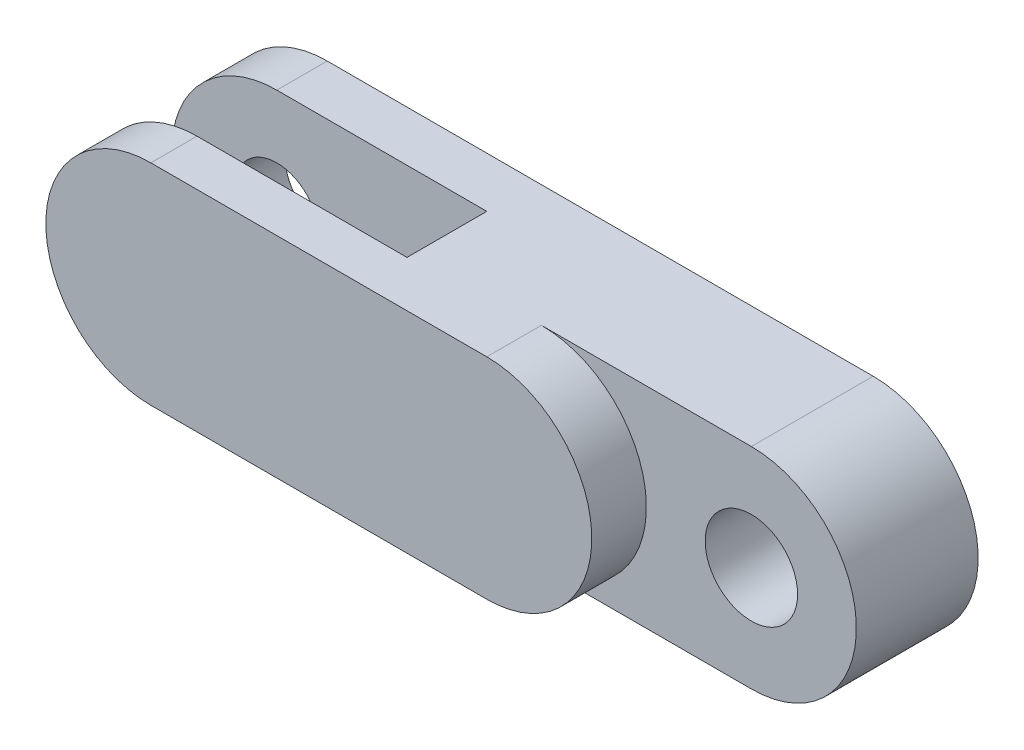
ISO-10303-21;
HEADER;
FILE_DESCRIPTION(('STEP AP214'),'2;1');
FILE_NAME('part.step','',(''),(''),'','','');
FILE_SCHEMA(('AUTOMOTIVE_DESIGN { 1 0 10303 214 1 1 1 1 }'));
ENDSEC;
DATA;
#1=APPLICATION_CONTEXT('core data for automotive mechanical design processes');
#2=APPLICATION_PROTOCOL_DEFINITION('international standard','automotive_design',2000,#1);
#3=PRODUCT_CONTEXT('',#1,'mechanical');
#4=PRODUCT('Part','Part','',(#3));
#5=PRODUCT_RELATED_PRODUCT_CATEGORY('part','',(#4));
#6=PRODUCT_DEFINITION_FORMATION('','',#4);
#7=PRODUCT_DEFINITION_CONTEXT('part definition',#1,'design');
#8=PRODUCT_DEFINITION('design','',#6,#7);
#9=PRODUCT_DEFINITION_SHAPE('','',#8);
#10=(LENGTH_UNIT() NAMED_UNIT(*) SI_UNIT(.MILLI.,.METRE.));
#11=(NAMED_UNIT(*) PLANE_ANGLE_UNIT() SI_UNIT($,.RADIAN.));
#12=(NAMED_UNIT(*) SI_UNIT($,.STERADIAN.) SOLID_ANGLE_UNIT());
#13=UNCERTAINTY_MEASURE_WITH_UNIT(LENGTH_MEASURE(1.E-05),#10,'distance_accuracy_value','');
#14=(GEOMETRIC_REPRESENTATION_CONTEXT(3) GLOBAL_UNCERTAINTY_ASSIGNED_CONTEXT((#13)) GLOBAL_UNIT_ASSIGNED_CONTEXT((#10,
#11,#12)) REPRESENTATION_CONTEXT('',''));
#15=CARTESIAN_POINT('',(0.,0.,0.));
#16=DIRECTION('',(0.,0.,1.));
#17=DIRECTION('',(1.,0.,0.));
#18=AXIS2_PLACEMENT_3D('',#15,#16,#17);
#19=CARTESIAN_POINT('',(6.5,2.5,2.1));
#20=DIRECTION('',(0.,-1.,0.));
#21=DIRECTION('',(1.,0.,0.));
#22=AXIS2_PLACEMENT_3D('',#19,#20,#21);
#23=PLANE('',#22);
#24=DIRECTION('',(1.,0.,0.));
#25=VECTOR('',#24,1.);
#26=CARTESIAN_POINT('',(-9.,2.5,-0.9));
#27=LINE('',#26,#25);
#28=CARTESIAN_POINT('',(-6.5,2.5,-0.9));
#29=VERTEX_POINT('',#28);
#30=CARTESIAN_POINT('',(-1.5,2.5,-0.9));
#31=VERTEX_POINT('',#30);
#32=EDGE_CURVE('E138',#29,#31,#27,.T.);
#33=ORIENTED_EDGE('',*,*,#32,.T.);
#34=DIRECTION('',(0.,0.,1.));
#35=VECTOR('',#34,1.);
#36=CARTESIAN_POINT('',(-1.5,2.5,-0.9));
#37=LINE('',#36,#35);
#38=CARTESIAN_POINT('',(-1.5,2.5,1.));
#39=VERTEX_POINT('',#38);
#40=EDGE_CURVE('E123',#31,#39,#37,.T.);
#41=ORIENTED_EDGE('',*,*,#40,.T.);
#42=DIRECTION('',(1.,0.,0.));
#43=VECTOR('',#42,1.);
#44=CARTESIAN_POINT('',(-9.,2.5,1.));
#45=LINE('',#44,#43);
#46=CARTESIAN_POINT('',(-6.5,2.5,1.));
#47=VERTEX_POINT('',#46);
#48=EDGE_CURVE('E115',#47,#39,#45,.T.);
#49=ORIENTED_EDGE('',*,*,#48,.F.);
#50=DIRECTION('',(0.,0.,-1.));
#51=VECTOR('',#50,1.);
#52=CARTESIAN_POINT('',(-6.5,2.5,2.1));
#53=LINE('',#52,#51);
#54=CARTESIAN_POINT('',(-6.5,2.5,2.1));
#55=VERTEX_POINT('',#54);
#56=EDGE_CURVE('E219',#55,#47,#53,.T.);
#57=ORIENTED_EDGE('',*,*,#56,.F.);
#58=DIRECTION('',(-1.,0.,0.));
#59=VECTOR('',#58,1.);
#60=CARTESIAN_POINT('',(6.5,2.5,2.1));
#61=LINE('',#60,#59);
#62=CARTESIAN_POINT('',(1.5,2.5,2.1));
#63=VERTEX_POINT('',#62);
#64=EDGE_CURVE('E185',#63,#55,#61,.T.);
#65=ORIENTED_EDGE('',*,*,#64,.F.);
#66=DIRECTION('',(0.,0.,1.));
#67=VECTOR('',#66,1.);
#68=CARTESIAN_POINT('',(1.5,2.5,0.8));
#69=LINE('',#68,#67);
#70=CARTESIAN_POINT('',(1.5,2.5,0.8));
#71=VERTEX_POINT('',#70);
#72=EDGE_CURVE('E63',#71,#63,#69,.T.);
#73=ORIENTED_EDGE('',*,*,#72,.F.);
#74=DIRECTION('',(-1.,0.,0.));
#75=VECTOR('',#74,1.);
#76=CARTESIAN_POINT('',(0.,2.5,0.8));
#77=LINE('',#76,#75);
#78=CARTESIAN_POINT('',(6.5,2.5,0.8));
#79=VERTEX_POINT('',#78);
#80=EDGE_CURVE('E172',#79,#71,#77,.T.);
#81=ORIENTED_EDGE('',*,*,#80,.F.);
#82=DIRECTION('',(0.,0.,-1.));
#83=VECTOR('',#82,1.);
#84=CARTESIAN_POINT('',(6.5,2.5,2.1));
#85=LINE('',#84,#83);
#86=CARTESIAN_POINT('',(6.5,2.5,-2.1));
#87=VERTEX_POINT('',#86);
#88=EDGE_CURVE('E222',#79,#87,#85,.T.);
#89=ORIENTED_EDGE('',*,*,#88,.T.);
#90=DIRECTION('',(-1.,0.,0.));
#91=VECTOR('',#90,1.);
#92=CARTESIAN_POINT('',(6.5,2.5,-2.1));
#93=LINE('',#92,#91);
#94=CARTESIAN_POINT('',(-6.5,2.5,-2.1));
#95=VERTEX_POINT('',#94);
#96=EDGE_CURVE('E200',#87,#95,#93,.T.);
#97=ORIENTED_EDGE('',*,*,#96,.T.);
#98=EDGE_CURVE('E218',#29,#95,#53,.T.);
#99=ORIENTED_EDGE('',*,*,#98,.F.);
#100=EDGE_LOOP('',(#33,#41,#49,#57,#65,#73,#81,#89,#97,#99));
#101=FACE_BOUND('',#100,.T.);
#102=ADVANCED_FACE('F39',(#101),#23,.F.);
#103=CARTESIAN_POINT('',(-6.5,0.,2.1));
#104=DIRECTION('',(0.,0.,-1.));
#105=DIRECTION('',(-1.,0.,0.));
#106=AXIS2_PLACEMENT_3D('',#103,#104,#105);
#107=CYLINDRICAL_SURFACE('',#106,2.5);
#108=CARTESIAN_POINT('',(-6.5,0.,-0.900000000000001));
#109=DIRECTION('',(0.,0.,1.));
#110=DIRECTION('',(1.,0.,0.));
#111=AXIS2_PLACEMENT_3D('',#108,#109,#110);
#112=CIRCLE('',#111,2.5);
#113=CARTESIAN_POINT('',(-6.5,-2.5,-0.9));
#114=VERTEX_POINT('',#113);
#115=EDGE_CURVE('E151',#29,#114,#112,.T.);
#116=ORIENTED_EDGE('',*,*,#115,.F.);
#117=ORIENTED_EDGE('',*,*,#98,.T.);
#118=CARTESIAN_POINT('',(-6.5,0.,-2.1));
#119=DIRECTION('',(0.,0.,1.));
#120=DIRECTION('',(1.,0.,0.));
#121=AXIS2_PLACEMENT_3D('',#118,#119,#120);
#122=CIRCLE('',#121,2.5);
#123=CARTESIAN_POINT('',(-6.5,-2.5,-2.1));
#124=VERTEX_POINT('',#123);
#125=EDGE_CURVE('E204',#95,#124,#122,.T.);
#126=ORIENTED_EDGE('',*,*,#125,.T.);
#127=DIRECTION('',(0.,0.,-1.));
#128=VECTOR('',#127,1.);
#129=CARTESIAN_POINT('',(-6.5,-2.5,2.1));
#130=LINE('',#129,#128);
#131=EDGE_CURVE('E213',#114,#124,#130,.T.);
#132=ORIENTED_EDGE('',*,*,#131,.F.);
#133=EDGE_LOOP('',(#116,#117,#126,#132));
#134=FACE_BOUND('',#133,.T.);
#135=ADVANCED_FACE('F255',(#134),#107,.T.);
#136=CARTESIAN_POINT('',(6.5,-2.5,2.1));
#137=DIRECTION('',(0.,1.,0.));
#138=DIRECTION('',(-1.,0.,0.));
#139=AXIS2_PLACEMENT_3D('',#136,#137,#138);
#140=PLANE('',#139);
#141=DIRECTION('',(1.,0.,0.));
#142=VECTOR('',#141,1.);
#143=CARTESIAN_POINT('',(6.5,-2.5,-0.900000000000001));
#144=LINE('',#143,#142);
#145=CARTESIAN_POINT('',(-1.5,-2.5,-0.9));
#146=VERTEX_POINT('',#145);
#147=EDGE_CURVE('E11',#114,#146,#144,.T.);
#148=ORIENTED_EDGE('',*,*,#147,.F.);
#149=ORIENTED_EDGE('',*,*,#131,.T.);
#150=DIRECTION('',(1.,0.,0.));
#151=VECTOR('',#150,1.);
#152=CARTESIAN_POINT('',(6.5,-2.5,-2.1));
#153=LINE('',#152,#151);
#154=CARTESIAN_POINT('',(6.5,-2.5,-2.1));
#155=VERTEX_POINT('',#154);
#156=EDGE_CURVE('E189',#124,#155,#153,.T.);
#157=ORIENTED_EDGE('',*,*,#156,.T.);
#158=DIRECTION('',(0.,0.,-1.));
#159=VECTOR('',#158,1.);
#160=CARTESIAN_POINT('',(6.5,-2.5,2.1));
#161=LINE('',#160,#159);
#162=CARTESIAN_POINT('',(6.5,-2.5,0.8));
#163=VERTEX_POINT('',#162);
#164=EDGE_CURVE('E196',#163,#155,#161,.T.);
#165=ORIENTED_EDGE('',*,*,#164,.F.);
#166=DIRECTION('',(1.,0.,0.));
#167=VECTOR('',#166,1.);
#168=CARTESIAN_POINT('',(0.,-2.5,0.8));
#169=LINE('',#168,#167);
#170=CARTESIAN_POINT('',(1.5,-2.5,0.8));
#171=VERTEX_POINT('',#170);
#172=EDGE_CURVE('E166',#171,#163,#169,.T.);
#173=ORIENTED_EDGE('',*,*,#172,.F.);
#174=DIRECTION('',(0.,0.,1.));
#175=VECTOR('',#174,1.);
#176=CARTESIAN_POINT('',(1.5,-2.5,0.8));
#177=LINE('',#176,#175);
#178=CARTESIAN_POINT('',(1.5,-2.5,2.1));
#179=VERTEX_POINT('',#178);
#180=EDGE_CURVE('E176',#171,#179,#177,.T.);
#181=ORIENTED_EDGE('',*,*,#180,.T.);
#182=DIRECTION('',(1.,0.,0.));
#183=VECTOR('',#182,1.);
#184=CARTESIAN_POINT('',(6.5,-2.5,2.1));
#185=LINE('',#184,#183);
#186=CARTESIAN_POINT('',(-6.5,-2.5,2.1));
#187=VERTEX_POINT('',#186);
#188=EDGE_CURVE('E192',#187,#179,#185,.T.);
#189=ORIENTED_EDGE('',*,*,#188,.F.);
#190=CARTESIAN_POINT('',(-6.5,-2.5,1.));
#191=VERTEX_POINT('',#190);
#192=EDGE_CURVE('E214',#187,#191,#130,.T.);
#193=ORIENTED_EDGE('',*,*,#192,.T.);
#194=DIRECTION('',(1.,0.,0.));
#195=VECTOR('',#194,1.);
#196=CARTESIAN_POINT('',(6.5,-2.5,1.));
#197=LINE('',#196,#195);
#198=CARTESIAN_POINT('',(-1.5,-2.5,1.));
#199=VERTEX_POINT('',#198);
#200=EDGE_CURVE('E48',#191,#199,#197,.T.);
#201=ORIENTED_EDGE('',*,*,#200,.T.);
#202=DIRECTION('',(0.,0.,1.));
#203=VECTOR('',#202,1.);
#204=CARTESIAN_POINT('',(-1.5,-2.5,-0.9));
#205=LINE('',#204,#203);
#206=EDGE_CURVE('E132',#146,#199,#205,.T.);
#207=ORIENTED_EDGE('',*,*,#206,.F.);
#208=EDGE_LOOP('',(#148,#149,#157,#165,#173,#181,#189,#193,#201,#207));
#209=FACE_BOUND('',#208,.T.);
#210=ADVANCED_FACE('F227',(#209),#140,.F.);
#211=CARTESIAN_POINT('',(6.5,0.,2.1));
#212=DIRECTION('',(0.,0.,-1.));
#213=DIRECTION('',(-1.,0.,0.));
#214=AXIS2_PLACEMENT_3D('',#211,#212,#213);
#215=CYLINDRICAL_SURFACE('',#214,2.5);
#216=CARTESIAN_POINT('',(6.5,0.,0.8));
#217=DIRECTION('',(0.,0.,1.));
#218=DIRECTION('',(1.,0.,0.));
#219=AXIS2_PLACEMENT_3D('',#216,#217,#218);
#220=CIRCLE('',#219,2.5);
#221=EDGE_CURVE('E169',#163,#79,#220,.T.);
#222=ORIENTED_EDGE('',*,*,#221,.F.);
#223=ORIENTED_EDGE('',*,*,#164,.T.);
#224=CARTESIAN_POINT('',(6.5,0.,-2.1));
#225=DIRECTION('',(0.,0.,1.));
#226=DIRECTION('',(1.,0.,0.));
#227=AXIS2_PLACEMENT_3D('',#224,#225,#226);
#228=CIRCLE('',#227,2.5);
#229=EDGE_CURVE('E181',#155,#87,#228,.T.);
#230=ORIENTED_EDGE('',*,*,#229,.T.);
#231=ORIENTED_EDGE('',*,*,#88,.F.);
#232=EDGE_LOOP('',(#222,#223,#230,#231));
#233=FACE_BOUND('',#232,.T.);
#234=ADVANCED_FACE('F41',(#233),#215,.T.);
#235=CARTESIAN_POINT('',(6.5,0.,2.1));
#236=DIRECTION('',(0.,0.,1.));
#237=DIRECTION('',(1.,0.,0.));
#238=AXIS2_PLACEMENT_3D('',#235,#236,#237);
#239=PLANE('',#238);
#240=ORIENTED_EDGE('',*,*,#188,.T.);
#241=CARTESIAN_POINT('',(1.5,0.,2.1));
#242=DIRECTION('',(0.,0.,1.));
#243=DIRECTION('',(1.,0.,0.));
#244=AXIS2_PLACEMENT_3D('',#241,#242,#243);
#245=CIRCLE('',#244,2.5);
#246=EDGE_CURVE('E159',#179,#63,#245,.T.);
#247=ORIENTED_EDGE('',*,*,#246,.T.);
#248=ORIENTED_EDGE('',*,*,#64,.T.);
#249=CARTESIAN_POINT('',(-6.5,0.,2.1));
#250=DIRECTION('',(0.,0.,1.));
#251=DIRECTION('',(1.,0.,0.));
#252=AXIS2_PLACEMENT_3D('',#249,#250,#251);
#253=CIRCLE('',#252,2.5);
#254=EDGE_CURVE('E188',#55,#187,#253,.T.);
#255=ORIENTED_EDGE('',*,*,#254,.T.);
#256=EDGE_LOOP('',(#240,#247,#248,#255));
#257=FACE_BOUND('',#256,.T.);
#258=ADVANCED_FACE('F236',(#257),#239,.T.);
#259=ORIENTED_EDGE('',*,*,#56,.T.);
#260=CARTESIAN_POINT('',(-6.5,0.,1.));
#261=DIRECTION('',(0.,0.,1.));
#262=DIRECTION('',(1.,0.,0.));
#263=AXIS2_PLACEMENT_3D('',#260,#261,#262);
#264=CIRCLE('',#263,2.5);
#265=EDGE_CURVE('E117',#47,#191,#264,.T.);
#266=ORIENTED_EDGE('',*,*,#265,.T.);
#267=ORIENTED_EDGE('',*,*,#192,.F.);
#268=ORIENTED_EDGE('',*,*,#254,.F.);
#269=EDGE_LOOP('',(#259,#266,#267,#268));
#270=FACE_BOUND('',#269,.T.);
#271=ADVANCED_FACE('F232',(#270),#107,.T.);
#272=CARTESIAN_POINT('',(6.5,0.,-2.1));
#273=DIRECTION('',(0.,0.,1.));
#274=DIRECTION('',(1.,0.,0.));
#275=AXIS2_PLACEMENT_3D('',#272,#273,#274);
#276=PLANE('',#275);
#277=CARTESIAN_POINT('',(-6.5,0.,-2.1));
#278=DIRECTION('',(0.,0.,1.));
#279=DIRECTION('',(1.,0.,0.));
#280=AXIS2_PLACEMENT_3D('',#277,#278,#279);
#281=CIRCLE('',#280,1.);
#282=CARTESIAN_POINT('',(-5.5,0.,-2.1));
#283=VERTEX_POINT('',#282);
#284=EDGE_CURVE('E124',#283,#283,#281,.T.);
#285=ORIENTED_EDGE('',*,*,#284,.T.);
#286=EDGE_LOOP('',(#285));
#287=FACE_BOUND('',#286,.T.);
#288=CARTESIAN_POINT('',(6.5,0.,-2.1));
#289=DIRECTION('',(0.,0.,1.));
#290=DIRECTION('',(1.,0.,0.));
#291=AXIS2_PLACEMENT_3D('',#288,#289,#290);
#292=CIRCLE('',#291,1.1);
#293=CARTESIAN_POINT('',(7.6,0.,-2.1));
#294=VERTEX_POINT('',#293);
#295=EDGE_CURVE('E155',#294,#294,#292,.T.);
#296=ORIENTED_EDGE('',*,*,#295,.T.);
#297=EDGE_LOOP('',(#296));
#298=FACE_BOUND('',#297,.T.);
#299=ORIENTED_EDGE('',*,*,#229,.F.);
#300=ORIENTED_EDGE('',*,*,#156,.F.);
#301=ORIENTED_EDGE('',*,*,#125,.F.);
#302=ORIENTED_EDGE('',*,*,#96,.F.);
#303=EDGE_LOOP('',(#299,#300,#301,#302));
#304=FACE_BOUND('',#303,.T.);
#305=ADVANCED_FACE('F250',(#287,#298,#304),#276,.F.);
#306=CARTESIAN_POINT('',(1.5,0.,0.8));
#307=DIRECTION('',(0.,0.,1.));
#308=DIRECTION('',(1.,0.,0.));
#309=AXIS2_PLACEMENT_3D('',#306,#307,#308);
#310=CYLINDRICAL_SURFACE('',#309,2.5);
#311=ORIENTED_EDGE('',*,*,#246,.F.);
#312=ORIENTED_EDGE('',*,*,#180,.F.);
#313=CARTESIAN_POINT('',(1.5,0.,0.8));
#314=DIRECTION('',(0.,0.,1.));
#315=DIRECTION('',(1.,0.,0.));
#316=AXIS2_PLACEMENT_3D('',#313,#314,#315);
#317=CIRCLE('',#316,2.5);
#318=EDGE_CURVE('E163',#171,#71,#317,.T.);
#319=ORIENTED_EDGE('',*,*,#318,.T.);
#320=ORIENTED_EDGE('',*,*,#72,.T.);
#321=EDGE_LOOP('',(#311,#312,#319,#320));
#322=FACE_BOUND('',#321,.T.);
#323=ADVANCED_FACE('F237',(#322),#310,.T.);
#324=CARTESIAN_POINT('',(0.,0.,0.8));
#325=DIRECTION('',(0.,0.,1.));
#326=DIRECTION('',(1.,0.,0.));
#327=AXIS2_PLACEMENT_3D('',#324,#325,#326);
#328=PLANE('',#327);
#329=CARTESIAN_POINT('',(6.5,0.,0.8));
#330=DIRECTION('',(0.,0.,1.));
#331=DIRECTION('',(1.,0.,0.));
#332=AXIS2_PLACEMENT_3D('',#329,#330,#331);
#333=CIRCLE('',#332,1.1);
#334=CARTESIAN_POINT('',(7.6,0.,0.8));
#335=VERTEX_POINT('',#334);
#336=EDGE_CURVE('E154',#335,#335,#333,.T.);
#337=ORIENTED_EDGE('',*,*,#336,.F.);
#338=EDGE_LOOP('',(#337));
#339=FACE_BOUND('',#338,.T.);
#340=ORIENTED_EDGE('',*,*,#318,.F.);
#341=ORIENTED_EDGE('',*,*,#172,.T.);
#342=ORIENTED_EDGE('',*,*,#221,.T.);
#343=ORIENTED_EDGE('',*,*,#80,.T.);
#344=EDGE_LOOP('',(#340,#341,#342,#343));
#345=FACE_BOUND('',#344,.T.);
#346=ADVANCED_FACE('F243',(#339,#345),#328,.T.);
#347=CARTESIAN_POINT('',(6.5,0.,-2.1));
#348=DIRECTION('',(0.,0.,1.));
#349=DIRECTION('',(1.,0.,0.));
#350=AXIS2_PLACEMENT_3D('',#347,#348,#349);
#351=CYLINDRICAL_SURFACE('',#350,1.1);
#352=ORIENTED_EDGE('',*,*,#295,.F.);
#353=EDGE_LOOP('',(#352));
#354=FACE_BOUND('',#353,.T.);
#355=ORIENTED_EDGE('',*,*,#336,.T.);
#356=EDGE_LOOP('',(#355));
#357=FACE_BOUND('',#356,.T.);
#358=ADVANCED_FACE('F261',(#354,#357),#351,.F.);
#359=CARTESIAN_POINT('',(-9.,-2.5,-0.9));
#360=DIRECTION('',(0.,0.,1.));
#361=DIRECTION('',(1.,0.,0.));
#362=AXIS2_PLACEMENT_3D('',#359,#360,#361);
#363=PLANE('',#362);
#364=CARTESIAN_POINT('',(-6.5,0.,-0.9));
#365=DIRECTION('',(0.,0.,1.));
#366=DIRECTION('',(1.,0.,0.));
#367=AXIS2_PLACEMENT_3D('',#364,#365,#366);
#368=CIRCLE('',#367,1.);
#369=CARTESIAN_POINT('',(-5.5,0.,-0.9));
#370=VERTEX_POINT('',#369);
#371=EDGE_CURVE('E304',#370,#370,#368,.T.);
#372=ORIENTED_EDGE('',*,*,#371,.F.);
#373=EDGE_LOOP('',(#372));
#374=FACE_BOUND('',#373,.T.);
#375=ORIENTED_EDGE('',*,*,#115,.T.);
#376=ORIENTED_EDGE('',*,*,#147,.T.);
#377=DIRECTION('',(0.,1.,0.));
#378=VECTOR('',#377,1.);
#379=CARTESIAN_POINT('',(-1.5,-2.5,-0.9));
#380=LINE('',#379,#378);
#381=EDGE_CURVE('E135',#146,#31,#380,.T.);
#382=ORIENTED_EDGE('',*,*,#381,.T.);
#383=ORIENTED_EDGE('',*,*,#32,.F.);
#384=EDGE_LOOP('',(#375,#376,#382,#383));
#385=FACE_BOUND('',#384,.T.);
#386=ADVANCED_FACE('F259',(#374,#385),#363,.T.);
#387=CARTESIAN_POINT('',(-9.,-2.5,1.));
#388=DIRECTION('',(0.,0.,1.));
#389=DIRECTION('',(1.,0.,0.));
#390=AXIS2_PLACEMENT_3D('',#387,#388,#389);
#391=PLANE('',#390);
#392=ORIENTED_EDGE('',*,*,#48,.T.);
#393=DIRECTION('',(0.,1.,0.));
#394=VECTOR('',#393,1.);
#395=CARTESIAN_POINT('',(-1.5,-2.5,1.));
#396=LINE('',#395,#394);
#397=EDGE_CURVE('E55',#199,#39,#396,.T.);
#398=ORIENTED_EDGE('',*,*,#397,.F.);
#399=ORIENTED_EDGE('',*,*,#200,.F.);
#400=ORIENTED_EDGE('',*,*,#265,.F.);
#401=EDGE_LOOP('',(#392,#398,#399,#400));
#402=FACE_BOUND('',#401,.T.);
#403=ADVANCED_FACE('F116',(#402),#391,.F.);
#404=CARTESIAN_POINT('',(-1.5,-2.5,-0.9));
#405=DIRECTION('',(-1.,0.,0.));
#406=DIRECTION('',(0.,0.,1.));
#407=AXIS2_PLACEMENT_3D('',#404,#405,#406);
#408=PLANE('',#407);
#409=ORIENTED_EDGE('',*,*,#381,.F.);
#410=ORIENTED_EDGE('',*,*,#206,.T.);
#411=ORIENTED_EDGE('',*,*,#397,.T.);
#412=ORIENTED_EDGE('',*,*,#40,.F.);
#413=EDGE_LOOP('',(#409,#410,#411,#412));
#414=FACE_BOUND('',#413,.T.);
#415=ADVANCED_FACE('F129',(#414),#408,.T.);
#416=CARTESIAN_POINT('',(-6.5,0.,-2.1));
#417=DIRECTION('',(0.,0.,1.));
#418=DIRECTION('',(1.,0.,0.));
#419=AXIS2_PLACEMENT_3D('',#416,#417,#418);
#420=CYLINDRICAL_SURFACE('',#419,1.);
#421=ORIENTED_EDGE('',*,*,#284,.F.);
#422=EDGE_LOOP('',(#421));
#423=FACE_BOUND('',#422,.T.);
#424=ORIENTED_EDGE('',*,*,#371,.T.);
#425=EDGE_LOOP('',(#424));
#426=FACE_BOUND('',#425,.T.);
#427=ADVANCED_FACE('F293',(#423,#426),#420,.F.);
#428=CLOSED_SHELL('',(#102,#135,#210,#234,#258,#271,#305,#323,#346,#358,#386,#403,#415,#427));
#429=MANIFOLD_SOLID_BREP('B2',#428);
#430=ADVANCED_BREP_SHAPE_REPRESENTATION('',(#18,#429),#14);
#431=SHAPE_DEFINITION_REPRESENTATION(#9,#430);
ENDSEC;
END-ISO-10303-21;
